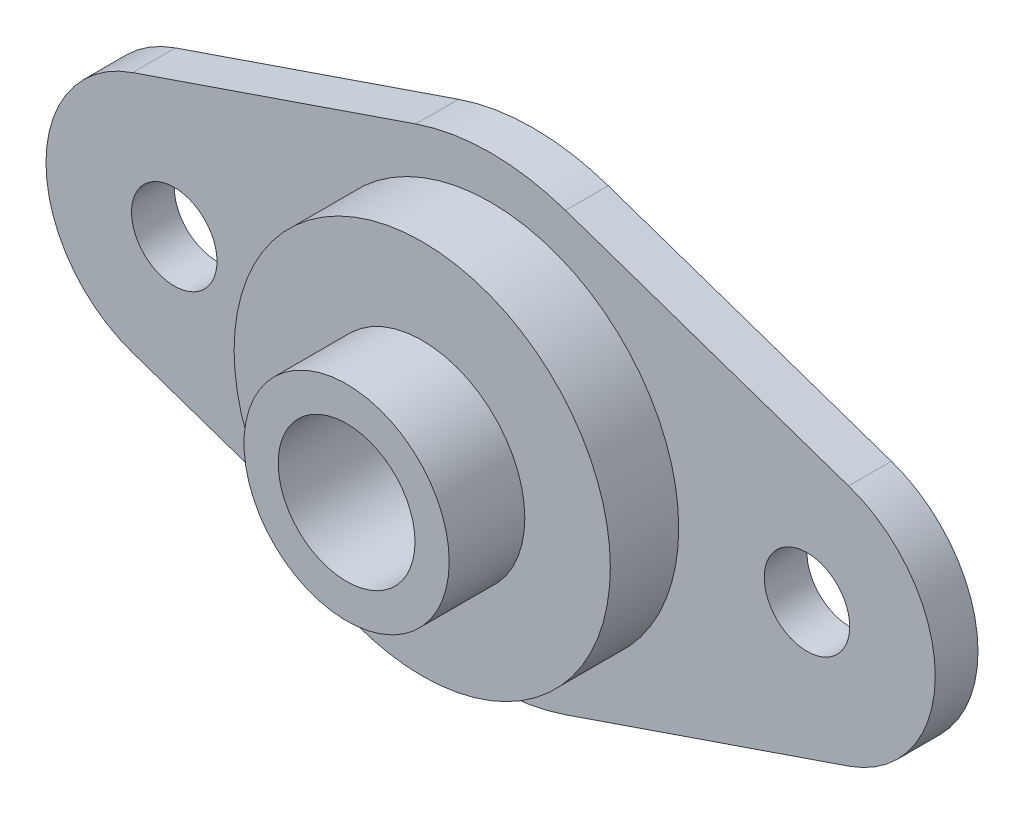
ISO-10303-21;
HEADER;
FILE_DESCRIPTION(('STEP AP214'),'2;1');
FILE_NAME('part.step','',(''),(''),'','','');
FILE_SCHEMA(('AUTOMOTIVE_DESIGN { 1 0 10303 214 1 1 1 1 }'));
ENDSEC;
DATA;
#1=APPLICATION_CONTEXT('core data for automotive mechanical design processes');
#2=APPLICATION_PROTOCOL_DEFINITION('international standard','automotive_design',2000,#1);
#3=PRODUCT_CONTEXT('',#1,'mechanical');
#4=PRODUCT('Part','Part','',(#3));
#5=PRODUCT_RELATED_PRODUCT_CATEGORY('part','',(#4));
#6=PRODUCT_DEFINITION_FORMATION('','',#4);
#7=PRODUCT_DEFINITION_CONTEXT('part definition',#1,'design');
#8=PRODUCT_DEFINITION('design','',#6,#7);
#9=PRODUCT_DEFINITION_SHAPE('','',#8);
#10=(LENGTH_UNIT() NAMED_UNIT(*) SI_UNIT(.MILLI.,.METRE.));
#11=(NAMED_UNIT(*) PLANE_ANGLE_UNIT() SI_UNIT($,.RADIAN.));
#12=(NAMED_UNIT(*) SI_UNIT($,.STERADIAN.) SOLID_ANGLE_UNIT());
#13=UNCERTAINTY_MEASURE_WITH_UNIT(LENGTH_MEASURE(1.E-05),#10,'distance_accuracy_value','');
#14=(GEOMETRIC_REPRESENTATION_CONTEXT(3) GLOBAL_UNCERTAINTY_ASSIGNED_CONTEXT((#13)) GLOBAL_UNIT_ASSIGNED_CONTEXT((#10,
#11,#12)) REPRESENTATION_CONTEXT('',''));
#15=CARTESIAN_POINT('',(0.,0.,0.));
#16=DIRECTION('',(0.,0.,1.));
#17=DIRECTION('',(1.,0.,0.));
#18=AXIS2_PLACEMENT_3D('',#15,#16,#17);
#19=CARTESIAN_POINT('',(0.,0.,2.5));
#20=DIRECTION('',(0.,0.,1.));
#21=DIRECTION('',(1.,0.,0.));
#22=AXIS2_PLACEMENT_3D('',#19,#20,#21);
#23=PLANE('',#22);
#24=CARTESIAN_POINT('',(18.5,0.,2.5));
#25=DIRECTION('',(0.,0.,1.));
#26=DIRECTION('',(1.,0.,0.));
#27=AXIS2_PLACEMENT_3D('',#24,#25,#26);
#28=CIRCLE('',#27,2.5);
#29=CARTESIAN_POINT('',(21.,0.,2.5));
#30=VERTEX_POINT('',#29);
#31=EDGE_CURVE('E196',#30,#30,#28,.T.);
#32=ORIENTED_EDGE('',*,*,#31,.F.);
#33=EDGE_LOOP('',(#32));
#34=FACE_BOUND('',#33,.T.);
#35=CARTESIAN_POINT('',(18.5,0.,2.5));
#36=DIRECTION('',(0.,0.,1.));
#37=DIRECTION('',(1.,0.,0.));
#38=AXIS2_PLACEMENT_3D('',#35,#36,#37);
#39=CIRCLE('',#38,7.5);
#40=CARTESIAN_POINT('',(20.9324324324324,7.0945945945946,2.5));
#41=VERTEX_POINT('',#40);
#42=CARTESIAN_POINT('',(20.9324324324324,-7.0945945945946,2.5));
#43=VERTEX_POINT('',#42);
#44=EDGE_CURVE('E453',#41,#43,#39,.F.);
#45=ORIENTED_EDGE('',*,*,#44,.F.);
#46=DIRECTION('',(-0.945945945945946,0.324324324324324,0.));
#47=VECTOR('',#46,1.);
#48=CARTESIAN_POINT('',(4.37837837837838,12.7702702702703,2.5));
#49=LINE('',#48,#47);
#50=CARTESIAN_POINT('',(4.37837837837838,12.7702702702703,2.5));
#51=VERTEX_POINT('',#50);
#52=EDGE_CURVE('E456',#41,#51,#49,.T.);
#53=ORIENTED_EDGE('',*,*,#52,.T.);
#54=CARTESIAN_POINT('',(0.,0.,2.5));
#55=DIRECTION('',(0.,0.,1.));
#56=DIRECTION('',(1.,0.,0.));
#57=AXIS2_PLACEMENT_3D('',#54,#55,#56);
#58=CIRCLE('',#57,13.5);
#59=CARTESIAN_POINT('',(-4.37837837837838,12.7702702702703,2.5));
#60=VERTEX_POINT('',#59);
#61=EDGE_CURVE('E125',#51,#60,#58,.T.);
#62=ORIENTED_EDGE('',*,*,#61,.T.);
#63=DIRECTION('',(0.945945945945946,0.324324324324324,0.));
#64=VECTOR('',#63,1.);
#65=CARTESIAN_POINT('',(-4.37837837837838,12.7702702702703,2.5));
#66=LINE('',#65,#64);
#67=CARTESIAN_POINT('',(-20.9324324324324,7.0945945945946,2.5));
#68=VERTEX_POINT('',#67);
#69=EDGE_CURVE('E460',#68,#60,#66,.T.);
#70=ORIENTED_EDGE('',*,*,#69,.F.);
#71=CARTESIAN_POINT('',(-18.5,0.,2.5));
#72=DIRECTION('',(0.,0.,1.));
#73=DIRECTION('',(1.,0.,0.));
#74=AXIS2_PLACEMENT_3D('',#71,#72,#73);
#75=CIRCLE('',#74,7.5);
#76=CARTESIAN_POINT('',(-20.9324324324324,-7.0945945945946,2.5));
#77=VERTEX_POINT('',#76);
#78=EDGE_CURVE('E131',#68,#77,#75,.T.);
#79=ORIENTED_EDGE('',*,*,#78,.T.);
#80=DIRECTION('',(0.945945945945946,-0.324324324324324,0.));
#81=VECTOR('',#80,1.);
#82=CARTESIAN_POINT('',(-4.37837837837838,-12.7702702702703,2.5));
#83=LINE('',#82,#81);
#84=CARTESIAN_POINT('',(-4.37837837837838,-12.7702702702703,2.5));
#85=VERTEX_POINT('',#84);
#86=EDGE_CURVE('E123',#77,#85,#83,.T.);
#87=ORIENTED_EDGE('',*,*,#86,.T.);
#88=CARTESIAN_POINT('',(4.37837837837838,-12.7702702702703,2.5));
#89=VERTEX_POINT('',#88);
#90=EDGE_CURVE('E113',#85,#89,#58,.T.);
#91=ORIENTED_EDGE('',*,*,#90,.T.);
#92=DIRECTION('',(-0.945945945945946,-0.324324324324324,0.));
#93=VECTOR('',#92,1.);
#94=CARTESIAN_POINT('',(4.37837837837838,-12.7702702702703,2.5));
#95=LINE('',#94,#93);
#96=EDGE_CURVE('E122',#43,#89,#95,.T.);
#97=ORIENTED_EDGE('',*,*,#96,.F.);
#98=EDGE_LOOP('',(#45,#53,#62,#70,#79,#87,#91,#97));
#99=FACE_BOUND('',#98,.T.);
#100=CARTESIAN_POINT('',(-18.5,0.,2.5));
#101=DIRECTION('',(0.,0.,1.));
#102=DIRECTION('',(1.,0.,0.));
#103=AXIS2_PLACEMENT_3D('',#100,#101,#102);
#104=CIRCLE('',#103,2.5);
#105=CARTESIAN_POINT('',(-16.,0.,2.5));
#106=VERTEX_POINT('',#105);
#107=EDGE_CURVE('E198',#106,#106,#104,.F.);
#108=ORIENTED_EDGE('',*,*,#107,.T.);
#109=EDGE_LOOP('',(#108));
#110=FACE_BOUND('',#109,.T.);
#111=CARTESIAN_POINT('',(0.,0.,2.5));
#112=DIRECTION('',(0.,0.,1.));
#113=DIRECTION('',(1.,0.,0.));
#114=AXIS2_PLACEMENT_3D('',#111,#112,#113);
#115=CIRCLE('',#114,11.);
#116=CARTESIAN_POINT('',(11.,0.,2.5));
#117=VERTEX_POINT('',#116);
#118=EDGE_CURVE('E433',#117,#117,#115,.T.);
#119=ORIENTED_EDGE('',*,*,#118,.F.);
#120=EDGE_LOOP('',(#119));
#121=FACE_BOUND('',#120,.T.);
#122=ADVANCED_FACE('F45',(#34,#99,#110,#121),#23,.T.);
#123=CARTESIAN_POINT('',(18.5,0.,2.5));
#124=DIRECTION('',(0.,0.,-1.));
#125=DIRECTION('',(-1.,0.,0.));
#126=AXIS2_PLACEMENT_3D('',#123,#124,#125);
#127=CYLINDRICAL_SURFACE('',#126,7.5);
#128=CARTESIAN_POINT('',(18.5,0.,0.));
#129=DIRECTION('',(0.,0.,1.));
#130=DIRECTION('',(1.,0.,0.));
#131=AXIS2_PLACEMENT_3D('',#128,#129,#130);
#132=CIRCLE('',#131,7.5);
#133=CARTESIAN_POINT('',(20.9324324324324,7.0945945945946,0.));
#134=VERTEX_POINT('',#133);
#135=CARTESIAN_POINT('',(20.9324324324324,-7.0945945945946,0.));
#136=VERTEX_POINT('',#135);
#137=EDGE_CURVE('E170',#134,#136,#132,.F.);
#138=ORIENTED_EDGE('',*,*,#137,.F.);
#139=DIRECTION('',(0.,0.,-1.));
#140=VECTOR('',#139,1.);
#141=CARTESIAN_POINT('',(20.9324324324324,7.0945945945946,2.5));
#142=LINE('',#141,#140);
#143=EDGE_CURVE('E11',#41,#134,#142,.T.);
#144=ORIENTED_EDGE('',*,*,#143,.F.);
#145=ORIENTED_EDGE('',*,*,#44,.T.);
#146=DIRECTION('',(0.,0.,-1.));
#147=VECTOR('',#146,1.);
#148=CARTESIAN_POINT('',(20.9324324324324,-7.0945945945946,2.5));
#149=LINE('',#148,#147);
#150=EDGE_CURVE('E63',#43,#136,#149,.T.);
#151=ORIENTED_EDGE('',*,*,#150,.T.);
#152=EDGE_LOOP('',(#138,#144,#145,#151));
#153=FACE_BOUND('',#152,.T.);
#154=ADVANCED_FACE('F230',(#153),#127,.T.);
#155=CARTESIAN_POINT('',(4.37837837837838,12.7702702702703,2.5));
#156=DIRECTION('',(-0.324324324324324,-0.945945945945946,0.));
#157=DIRECTION('',(0.945945945945946,-0.324324324324324,0.));
#158=AXIS2_PLACEMENT_3D('',#155,#156,#157);
#159=PLANE('',#158);
#160=DIRECTION('',(-0.945945945945946,0.324324324324324,0.));
#161=VECTOR('',#160,1.);
#162=CARTESIAN_POINT('',(4.37837837837838,12.7702702702703,0.));
#163=LINE('',#162,#161);
#164=CARTESIAN_POINT('',(4.37837837837838,12.7702702702703,0.));
#165=VERTEX_POINT('',#164);
#166=EDGE_CURVE('E166',#134,#165,#163,.T.);
#167=ORIENTED_EDGE('',*,*,#166,.T.);
#168=DIRECTION('',(0.,0.,-1.));
#169=VECTOR('',#168,1.);
#170=CARTESIAN_POINT('',(4.37837837837838,12.7702702702703,2.5));
#171=LINE('',#170,#169);
#172=EDGE_CURVE('E55',#51,#165,#171,.T.);
#173=ORIENTED_EDGE('',*,*,#172,.F.);
#174=ORIENTED_EDGE('',*,*,#52,.F.);
#175=ORIENTED_EDGE('',*,*,#143,.T.);
#176=EDGE_LOOP('',(#167,#173,#174,#175));
#177=FACE_BOUND('',#176,.T.);
#178=ADVANCED_FACE('F167',(#177),#159,.F.);
#179=CARTESIAN_POINT('',(0.,0.,2.5));
#180=DIRECTION('',(0.,0.,-1.));
#181=DIRECTION('',(-1.,0.,0.));
#182=AXIS2_PLACEMENT_3D('',#179,#180,#181);
#183=CYLINDRICAL_SURFACE('',#182,13.5);
#184=CARTESIAN_POINT('',(0.,0.,0.));
#185=DIRECTION('',(0.,0.,1.));
#186=DIRECTION('',(1.,0.,0.));
#187=AXIS2_PLACEMENT_3D('',#184,#185,#186);
#188=CIRCLE('',#187,13.5);
#189=CARTESIAN_POINT('',(-4.37837837837838,12.7702702702703,0.));
#190=VERTEX_POINT('',#189);
#191=EDGE_CURVE('E161',#165,#190,#188,.T.);
#192=ORIENTED_EDGE('',*,*,#191,.T.);
#193=DIRECTION('',(0.,0.,-1.));
#194=VECTOR('',#193,1.);
#195=CARTESIAN_POINT('',(-4.37837837837838,12.7702702702703,2.5));
#196=LINE('',#195,#194);
#197=EDGE_CURVE('E151',#60,#190,#196,.T.);
#198=ORIENTED_EDGE('',*,*,#197,.F.);
#199=ORIENTED_EDGE('',*,*,#61,.F.);
#200=ORIENTED_EDGE('',*,*,#172,.T.);
#201=EDGE_LOOP('',(#192,#198,#199,#200));
#202=FACE_BOUND('',#201,.T.);
#203=ADVANCED_FACE('F159',(#202),#183,.T.);
#204=CARTESIAN_POINT('',(-4.37837837837838,12.7702702702703,2.5));
#205=DIRECTION('',(-0.324324324324324,0.945945945945946,0.));
#206=DIRECTION('',(-0.945945945945946,-0.324324324324324,0.));
#207=AXIS2_PLACEMENT_3D('',#204,#205,#206);
#208=PLANE('',#207);
#209=DIRECTION('',(0.945945945945946,0.324324324324324,0.));
#210=VECTOR('',#209,1.);
#211=CARTESIAN_POINT('',(-4.37837837837838,12.7702702702703,0.));
#212=LINE('',#211,#210);
#213=CARTESIAN_POINT('',(-20.9324324324324,7.0945945945946,0.));
#214=VERTEX_POINT('',#213);
#215=EDGE_CURVE('E174',#214,#190,#212,.T.);
#216=ORIENTED_EDGE('',*,*,#215,.F.);
#217=DIRECTION('',(0.,0.,-1.));
#218=VECTOR('',#217,1.);
#219=CARTESIAN_POINT('',(-20.9324324324324,7.0945945945946,2.5));
#220=LINE('',#219,#218);
#221=EDGE_CURVE('E144',#68,#214,#220,.T.);
#222=ORIENTED_EDGE('',*,*,#221,.F.);
#223=ORIENTED_EDGE('',*,*,#69,.T.);
#224=ORIENTED_EDGE('',*,*,#197,.T.);
#225=EDGE_LOOP('',(#216,#222,#223,#224));
#226=FACE_BOUND('',#225,.T.);
#227=ADVANCED_FACE('F255',(#226),#208,.T.);
#228=CARTESIAN_POINT('',(-18.5,0.,2.5));
#229=DIRECTION('',(0.,0.,-1.));
#230=DIRECTION('',(-1.,0.,0.));
#231=AXIS2_PLACEMENT_3D('',#228,#229,#230);
#232=CYLINDRICAL_SURFACE('',#231,7.5);
#233=CARTESIAN_POINT('',(-18.5,0.,0.));
#234=DIRECTION('',(0.,0.,1.));
#235=DIRECTION('',(1.,0.,0.));
#236=AXIS2_PLACEMENT_3D('',#233,#234,#235);
#237=CIRCLE('',#236,7.5);
#238=CARTESIAN_POINT('',(-20.9324324324324,-7.0945945945946,0.));
#239=VERTEX_POINT('',#238);
#240=EDGE_CURVE('E183',#214,#239,#237,.T.);
#241=ORIENTED_EDGE('',*,*,#240,.T.);
#242=DIRECTION('',(0.,0.,-1.));
#243=VECTOR('',#242,1.);
#244=CARTESIAN_POINT('',(-20.9324324324324,-7.0945945945946,2.5));
#245=LINE('',#244,#243);
#246=EDGE_CURVE('E140',#77,#239,#245,.T.);
#247=ORIENTED_EDGE('',*,*,#246,.F.);
#248=ORIENTED_EDGE('',*,*,#78,.F.);
#249=ORIENTED_EDGE('',*,*,#221,.T.);
#250=EDGE_LOOP('',(#241,#247,#248,#249));
#251=FACE_BOUND('',#250,.T.);
#252=ADVANCED_FACE('F252',(#251),#232,.T.);
#253=CARTESIAN_POINT('',(-4.37837837837838,-12.7702702702703,2.5));
#254=DIRECTION('',(0.324324324324324,0.945945945945946,0.));
#255=DIRECTION('',(-0.945945945945946,0.324324324324324,0.));
#256=AXIS2_PLACEMENT_3D('',#253,#254,#255);
#257=PLANE('',#256);
#258=DIRECTION('',(0.945945945945946,-0.324324324324324,0.));
#259=VECTOR('',#258,1.);
#260=CARTESIAN_POINT('',(-4.37837837837838,-12.7702702702703,0.));
#261=LINE('',#260,#259);
#262=CARTESIAN_POINT('',(-4.37837837837838,-12.7702702702703,0.));
#263=VERTEX_POINT('',#262);
#264=EDGE_CURVE('E138',#239,#263,#261,.T.);
#265=ORIENTED_EDGE('',*,*,#264,.T.);
#266=DIRECTION('',(0.,0.,-1.));
#267=VECTOR('',#266,1.);
#268=CARTESIAN_POINT('',(-4.37837837837838,-12.7702702702703,2.5));
#269=LINE('',#268,#267);
#270=EDGE_CURVE('E117',#85,#263,#269,.T.);
#271=ORIENTED_EDGE('',*,*,#270,.F.);
#272=ORIENTED_EDGE('',*,*,#86,.F.);
#273=ORIENTED_EDGE('',*,*,#246,.T.);
#274=EDGE_LOOP('',(#265,#271,#272,#273));
#275=FACE_BOUND('',#274,.T.);
#276=ADVANCED_FACE('F137',(#275),#257,.F.);
#277=CARTESIAN_POINT('',(4.37837837837838,-12.7702702702703,0.));
#278=VERTEX_POINT('',#277);
#279=EDGE_CURVE('E176',#263,#278,#188,.T.);
#280=ORIENTED_EDGE('',*,*,#279,.T.);
#281=DIRECTION('',(0.,0.,-1.));
#282=VECTOR('',#281,1.);
#283=CARTESIAN_POINT('',(4.37837837837838,-12.7702702702703,2.5));
#284=LINE('',#283,#282);
#285=EDGE_CURVE('E89',#89,#278,#284,.T.);
#286=ORIENTED_EDGE('',*,*,#285,.F.);
#287=ORIENTED_EDGE('',*,*,#90,.F.);
#288=ORIENTED_EDGE('',*,*,#270,.T.);
#289=EDGE_LOOP('',(#280,#286,#287,#288));
#290=FACE_BOUND('',#289,.T.);
#291=ADVANCED_FACE('F115',(#290),#183,.T.);
#292=CARTESIAN_POINT('',(4.37837837837838,-12.7702702702703,2.5));
#293=DIRECTION('',(0.324324324324324,-0.945945945945946,0.));
#294=DIRECTION('',(0.945945945945946,0.324324324324324,0.));
#295=AXIS2_PLACEMENT_3D('',#292,#293,#294);
#296=PLANE('',#295);
#297=DIRECTION('',(-0.945945945945946,-0.324324324324324,0.));
#298=VECTOR('',#297,1.);
#299=CARTESIAN_POINT('',(4.37837837837838,-12.7702702702703,0.));
#300=LINE('',#299,#298);
#301=EDGE_CURVE('E189',#136,#278,#300,.T.);
#302=ORIENTED_EDGE('',*,*,#301,.F.);
#303=ORIENTED_EDGE('',*,*,#150,.F.);
#304=ORIENTED_EDGE('',*,*,#96,.T.);
#305=ORIENTED_EDGE('',*,*,#285,.T.);
#306=EDGE_LOOP('',(#302,#303,#304,#305));
#307=FACE_BOUND('',#306,.T.);
#308=ADVANCED_FACE('F218',(#307),#296,.T.);
#309=CARTESIAN_POINT('',(18.5,0.,2.5));
#310=DIRECTION('',(0.,0.,-1.));
#311=DIRECTION('',(-1.,0.,0.));
#312=AXIS2_PLACEMENT_3D('',#309,#310,#311);
#313=CYLINDRICAL_SURFACE('',#312,2.5);
#314=ORIENTED_EDGE('',*,*,#31,.T.);
#315=EDGE_LOOP('',(#314));
#316=FACE_BOUND('',#315,.T.);
#317=CARTESIAN_POINT('',(18.5,0.,0.));
#318=DIRECTION('',(0.,0.,1.));
#319=DIRECTION('',(1.,0.,0.));
#320=AXIS2_PLACEMENT_3D('',#317,#318,#319);
#321=CIRCLE('',#320,2.5);
#322=CARTESIAN_POINT('',(21.,0.,0.));
#323=VERTEX_POINT('',#322);
#324=EDGE_CURVE('E177',#323,#323,#321,.T.);
#325=ORIENTED_EDGE('',*,*,#324,.F.);
#326=EDGE_LOOP('',(#325));
#327=FACE_BOUND('',#326,.T.);
#328=ADVANCED_FACE('F216',(#316,#327),#313,.F.);
#329=CARTESIAN_POINT('',(0.,0.,2.5));
#330=DIRECTION('',(0.,0.,-1.));
#331=DIRECTION('',(-1.,0.,0.));
#332=AXIS2_PLACEMENT_3D('',#329,#330,#331);
#333=CYLINDRICAL_SURFACE('',#332,4.);
#334=CARTESIAN_POINT('',(0.,0.,0.));
#335=DIRECTION('',(0.,0.,1.));
#336=DIRECTION('',(1.,0.,0.));
#337=AXIS2_PLACEMENT_3D('',#334,#335,#336);
#338=CIRCLE('',#337,4.);
#339=CARTESIAN_POINT('',(4.,0.,0.));
#340=VERTEX_POINT('',#339);
#341=EDGE_CURVE('E206',#340,#340,#338,.T.);
#342=ORIENTED_EDGE('',*,*,#341,.F.);
#343=EDGE_LOOP('',(#342));
#344=FACE_BOUND('',#343,.T.);
#345=CARTESIAN_POINT('',(0.,0.,10.922));
#346=DIRECTION('',(0.,0.,1.));
#347=DIRECTION('',(1.,0.,0.));
#348=AXIS2_PLACEMENT_3D('',#345,#346,#347);
#349=CIRCLE('',#348,4.);
#350=CARTESIAN_POINT('',(4.,0.,10.922));
#351=VERTEX_POINT('',#350);
#352=EDGE_CURVE('E440',#351,#351,#349,.T.);
#353=ORIENTED_EDGE('',*,*,#352,.T.);
#354=EDGE_LOOP('',(#353));
#355=FACE_BOUND('',#354,.T.);
#356=ADVANCED_FACE('F47',(#344,#355),#333,.F.);
#357=CARTESIAN_POINT('',(-18.5,0.,2.5));
#358=DIRECTION('',(0.,0.,-1.));
#359=DIRECTION('',(-1.,0.,0.));
#360=AXIS2_PLACEMENT_3D('',#357,#358,#359);
#361=CYLINDRICAL_SURFACE('',#360,2.5);
#362=ORIENTED_EDGE('',*,*,#107,.F.);
#363=EDGE_LOOP('',(#362));
#364=FACE_BOUND('',#363,.T.);
#365=CARTESIAN_POINT('',(-18.5,0.,0.));
#366=DIRECTION('',(0.,0.,1.));
#367=DIRECTION('',(1.,0.,0.));
#368=AXIS2_PLACEMENT_3D('',#365,#366,#367);
#369=CIRCLE('',#368,2.5);
#370=CARTESIAN_POINT('',(-16.,0.,0.));
#371=VERTEX_POINT('',#370);
#372=EDGE_CURVE('E193',#371,#371,#369,.F.);
#373=ORIENTED_EDGE('',*,*,#372,.T.);
#374=EDGE_LOOP('',(#373));
#375=FACE_BOUND('',#374,.T.);
#376=ADVANCED_FACE('F224',(#364,#375),#361,.F.);
#377=CARTESIAN_POINT('',(0.,0.,0.));
#378=DIRECTION('',(0.,0.,1.));
#379=DIRECTION('',(1.,0.,0.));
#380=AXIS2_PLACEMENT_3D('',#377,#378,#379);
#381=PLANE('',#380);
#382=ORIENTED_EDGE('',*,*,#341,.T.);
#383=EDGE_LOOP('',(#382));
#384=FACE_BOUND('',#383,.T.);
#385=ORIENTED_EDGE('',*,*,#372,.F.);
#386=EDGE_LOOP('',(#385));
#387=FACE_BOUND('',#386,.T.);
#388=ORIENTED_EDGE('',*,*,#137,.T.);
#389=ORIENTED_EDGE('',*,*,#301,.T.);
#390=ORIENTED_EDGE('',*,*,#279,.F.);
#391=ORIENTED_EDGE('',*,*,#264,.F.);
#392=ORIENTED_EDGE('',*,*,#240,.F.);
#393=ORIENTED_EDGE('',*,*,#215,.T.);
#394=ORIENTED_EDGE('',*,*,#191,.F.);
#395=ORIENTED_EDGE('',*,*,#166,.F.);
#396=EDGE_LOOP('',(#388,#389,#390,#391,#392,#393,#394,#395));
#397=FACE_BOUND('',#396,.T.);
#398=ORIENTED_EDGE('',*,*,#324,.T.);
#399=EDGE_LOOP('',(#398));
#400=FACE_BOUND('',#399,.T.);
#401=ADVANCED_FACE('F214',(#384,#387,#397,#400),#381,.F.);
#402=CARTESIAN_POINT('',(0.,0.,10.922));
#403=DIRECTION('',(0.,0.,1.));
#404=DIRECTION('',(1.,0.,0.));
#405=AXIS2_PLACEMENT_3D('',#402,#403,#404);
#406=PLANE('',#405);
#407=CARTESIAN_POINT('',(0.,0.,10.922));
#408=DIRECTION('',(0.,0.,1.));
#409=DIRECTION('',(1.,0.,0.));
#410=AXIS2_PLACEMENT_3D('',#407,#408,#409);
#411=CIRCLE('',#410,6.);
#412=CARTESIAN_POINT('',(6.,0.,10.922));
#413=VERTEX_POINT('',#412);
#414=EDGE_CURVE('E209',#413,#413,#411,.T.);
#415=ORIENTED_EDGE('',*,*,#414,.T.);
#416=EDGE_LOOP('',(#415));
#417=FACE_BOUND('',#416,.T.);
#418=ORIENTED_EDGE('',*,*,#352,.F.);
#419=EDGE_LOOP('',(#418));
#420=FACE_BOUND('',#419,.T.);
#421=ADVANCED_FACE('F243',(#417,#420),#406,.T.);
#422=CARTESIAN_POINT('',(0.,0.,10.922));
#423=DIRECTION('',(0.,0.,-1.));
#424=DIRECTION('',(-1.,0.,0.));
#425=AXIS2_PLACEMENT_3D('',#422,#423,#424);
#426=CYLINDRICAL_SURFACE('',#425,6.);
#427=CARTESIAN_POINT('',(0.,0.,6.5));
#428=DIRECTION('',(0.,0.,1.));
#429=DIRECTION('',(1.,0.,0.));
#430=AXIS2_PLACEMENT_3D('',#427,#428,#429);
#431=CIRCLE('',#430,6.);
#432=CARTESIAN_POINT('',(6.,0.,6.5));
#433=VERTEX_POINT('',#432);
#434=EDGE_CURVE('E436',#433,#433,#431,.T.);
#435=ORIENTED_EDGE('',*,*,#434,.T.);
#436=EDGE_LOOP('',(#435));
#437=FACE_BOUND('',#436,.T.);
#438=ORIENTED_EDGE('',*,*,#414,.F.);
#439=EDGE_LOOP('',(#438));
#440=FACE_BOUND('',#439,.T.);
#441=ADVANCED_FACE('F239',(#437,#440),#426,.T.);
#442=CARTESIAN_POINT('',(0.,0.,6.5));
#443=DIRECTION('',(0.,0.,1.));
#444=DIRECTION('',(1.,0.,0.));
#445=AXIS2_PLACEMENT_3D('',#442,#443,#444);
#446=PLANE('',#445);
#447=CARTESIAN_POINT('',(0.,0.,6.5));
#448=DIRECTION('',(0.,0.,1.));
#449=DIRECTION('',(1.,0.,0.));
#450=AXIS2_PLACEMENT_3D('',#447,#448,#449);
#451=CIRCLE('',#450,11.);
#452=CARTESIAN_POINT('',(11.,0.,6.5));
#453=VERTEX_POINT('',#452);
#454=EDGE_CURVE('E430',#453,#453,#451,.T.);
#455=ORIENTED_EDGE('',*,*,#454,.T.);
#456=EDGE_LOOP('',(#455));
#457=FACE_BOUND('',#456,.T.);
#458=ORIENTED_EDGE('',*,*,#434,.F.);
#459=EDGE_LOOP('',(#458));
#460=FACE_BOUND('',#459,.T.);
#461=ADVANCED_FACE('F338',(#457,#460),#446,.T.);
#462=CARTESIAN_POINT('',(0.,0.,6.5));
#463=DIRECTION('',(0.,0.,-1.));
#464=DIRECTION('',(-1.,0.,0.));
#465=AXIS2_PLACEMENT_3D('',#462,#463,#464);
#466=CYLINDRICAL_SURFACE('',#465,11.);
#467=ORIENTED_EDGE('',*,*,#454,.F.);
#468=EDGE_LOOP('',(#467));
#469=FACE_BOUND('',#468,.T.);
#470=ORIENTED_EDGE('',*,*,#118,.T.);
#471=EDGE_LOOP('',(#470));
#472=FACE_BOUND('',#471,.T.);
#473=ADVANCED_FACE('F348',(#469,#472),#466,.T.);
#474=CLOSED_SHELL('',(#122,#154,#178,#203,#227,#252,#276,#291,#308,#328,#356,#376,#401,#421,
#441,#461,#473));
#475=MANIFOLD_SOLID_BREP('B2',#474);
#476=ADVANCED_BREP_SHAPE_REPRESENTATION('',(#18,#475),#14);
#477=SHAPE_DEFINITION_REPRESENTATION(#9,#476);
ENDSEC;
END-ISO-10303-21;
